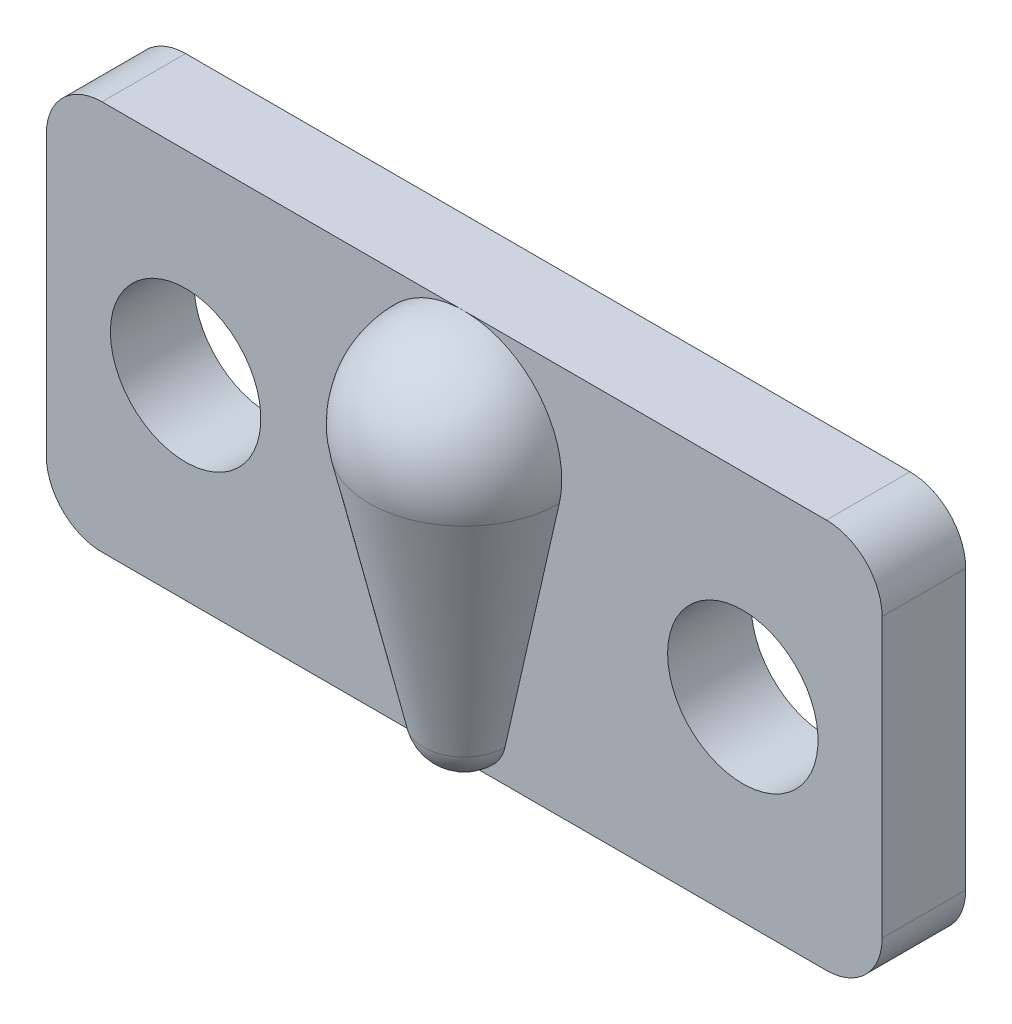
ISO-10303-21;
HEADER;
FILE_DESCRIPTION(('STEP AP214'),'2;1');
FILE_NAME('part.step','',(''),(''),'','','');
FILE_SCHEMA(('AUTOMOTIVE_DESIGN { 1 0 10303 214 1 1 1 1 }'));
ENDSEC;
DATA;
#1=APPLICATION_CONTEXT('core data for automotive mechanical design processes');
#2=APPLICATION_PROTOCOL_DEFINITION('international standard','automotive_design',2000,#1);
#3=PRODUCT_CONTEXT('',#1,'mechanical');
#4=PRODUCT('Part','Part','',(#3));
#5=PRODUCT_RELATED_PRODUCT_CATEGORY('part','',(#4));
#6=PRODUCT_DEFINITION_FORMATION('','',#4);
#7=PRODUCT_DEFINITION_CONTEXT('part definition',#1,'design');
#8=PRODUCT_DEFINITION('design','',#6,#7);
#9=PRODUCT_DEFINITION_SHAPE('','',#8);
#10=(LENGTH_UNIT() NAMED_UNIT(*) SI_UNIT(.MILLI.,.METRE.));
#11=(NAMED_UNIT(*) PLANE_ANGLE_UNIT() SI_UNIT($,.RADIAN.));
#12=(NAMED_UNIT(*) SI_UNIT($,.STERADIAN.) SOLID_ANGLE_UNIT());
#13=UNCERTAINTY_MEASURE_WITH_UNIT(LENGTH_MEASURE(1.E-05),#10,'distance_accuracy_value','');
#14=(GEOMETRIC_REPRESENTATION_CONTEXT(3) GLOBAL_UNCERTAINTY_ASSIGNED_CONTEXT((#13)) GLOBAL_UNIT_ASSIGNED_CONTEXT((#10,
#11,#12)) REPRESENTATION_CONTEXT('',''));
#15=CARTESIAN_POINT('',(0.,0.,0.));
#16=DIRECTION('',(0.,0.,1.));
#17=DIRECTION('',(1.,0.,0.));
#18=AXIS2_PLACEMENT_3D('',#15,#16,#17);
#19=CARTESIAN_POINT('',(15.,10.5000001043081,0.));
#20=DIRECTION('',(1.,0.,0.));
#21=DIRECTION('',(0.,1.,0.));
#22=AXIS2_PLACEMENT_3D('',#19,#20,#21);
#23=SPHERICAL_SURFACE('',#22,3.50000000000001);
#24=CARTESIAN_POINT('',(11.5875138472931,9.72222233554403,0.));
#25=CARTESIAN_POINT('',(11.5583884394164,9.85021598104194,0.));
#26=CARTESIAN_POINT('',(11.5365329148703,9.97902761785456,0.));
#27=CARTESIAN_POINT('',(11.5073616324393,10.2382868741093,0.));
#28=CARTESIAN_POINT('',(11.5000458745544,10.3687344935513,0.));
#29=CARTESIAN_POINT('',(11.5,10.5000001043081,0.));
#30=B_SPLINE_CURVE_WITH_KNOTS('',3,(#24,#25,#26,#27,#28,#29),.UNSPECIFIED.,.F.,.F.,(4,2,4),(0.,
0.391957798217862,0.783915596435724),.UNSPECIFIED.);
#31=CARTESIAN_POINT('',(11.5875138472902,9.72222233554242,0.));
#32=VERTEX_POINT('',#31);
#33=CARTESIAN_POINT('',(11.5,10.5000001041967,0.));
#34=VERTEX_POINT('',#33);
#35=EDGE_CURVE('E67',#32,#34,#30,.T.);
#36=ORIENTED_EDGE('',*,*,#35,.F.);
#37=CARTESIAN_POINT('',(15.,9.72222233554021,0.));
#38=DIRECTION('',(0.,1.,0.));
#39=DIRECTION('',(-1.,0.,0.));
#40=AXIS2_PLACEMENT_3D('',#37,#38,#39);
#41=CIRCLE('',#40,3.41248615271241);
#42=CARTESIAN_POINT('',(18.4124861527065,9.72222233554211,0.));
#43=VERTEX_POINT('',#42);
#44=EDGE_CURVE('E21',#43,#32,#41,.F.);
#45=ORIENTED_EDGE('',*,*,#44,.F.);
#46=CARTESIAN_POINT('',(18.5,10.5000001043081,0.));
#47=CARTESIAN_POINT('',(18.5,10.4999667709748,0.));
#48=CARTESIAN_POINT('',(18.4999999995238,10.4999334376414,0.));
#49=CARTESIAN_POINT('',(18.4999999966667,10.4998334376415,0.));
#50=CARTESIAN_POINT('',(18.4999999928572,10.4997667709749,0.));
#51=CARTESIAN_POINT('',(18.4999999642856,10.4994334376407,0.));
#52=CARTESIAN_POINT('',(18.4999999109516,10.4991667709745,0.));
#53=CARTESIAN_POINT('',(18.499999491908,10.4978334375931,0.));
#54=CARTESIAN_POINT('',(18.4999986690785,10.4967667710401,0.));
#55=CARTESIAN_POINT('',(18.4999921165338,10.4914334338371,0.));
#56=CARTESIAN_POINT('',(18.4999790716267,10.4871667699362,0.));
#57=CARTESIAN_POINT('',(18.499874846824,10.4658332089908,0.));
#58=CARTESIAN_POINT('',(18.4996666661411,10.4487668717378,0.));
#59=CARTESIAN_POINT('',(18.4980006604353,10.363418003463,0.));
#60=CARTESIAN_POINT('',(18.4946675281748,10.2951662442738,0.));
#61=CARTESIAN_POINT('',(18.476066568315,10.0573102485838,0.));
#62=CARTESIAN_POINT('',(18.450411237414,9.88845712822485,0.));
#63=CARTESIAN_POINT('',(18.4124861527069,9.72222233554402,0.));
#64=B_SPLINE_CURVE_WITH_KNOTS('',3,(#46,#47,#48,#49,#50,#51,#52,#53,#54,#55,#56,#57,#58,#59,#60,
#61,#62,#63),.UNSPECIFIED.,.F.,.F.,(4,2,2,2,2,2,2,2,4),(0.,9.99999999957324E-05,
0.000300000000078214,0.00110000000530257,0.00430000033967038,0.0171000217393052,
0.0683013914361899,0.273189175395802,0.783842066614435),.UNSPECIFIED.);
#65=CARTESIAN_POINT('',(18.5,10.5000001042563,0.));
#66=VERTEX_POINT('',#65);
#67=EDGE_CURVE('E53',#66,#43,#64,.T.);
#68=ORIENTED_EDGE('',*,*,#67,.F.);
#69=CARTESIAN_POINT('',(15.,14.0000001043081,0.));
#70=CARTESIAN_POINT('',(15.0984431740857,14.0000095369525,0.));
#71=CARTESIAN_POINT('',(15.1968818772213,13.995846827415,0.));
#72=CARTESIAN_POINT('',(15.3930549707358,13.9792501201021,0.));
#73=CARTESIAN_POINT('',(15.490789394673,13.9668165190966,0.));
#74=CARTESIAN_POINT('',(15.6847948111063,13.9337635043705,0.));
#75=CARTESIAN_POINT('',(15.7810668535947,13.9131502830936,0.));
#76=CARTESIAN_POINT('',(15.9715087844218,13.8639052324162,0.));
#77=CARTESIAN_POINT('',(16.0656786984063,13.8352735008992,0.));
#78=CARTESIAN_POINT('',(16.344126633369,13.7375818355791,0.));
#79=CARTESIAN_POINT('',(16.5244217973923,13.6567119083841,0.));
#80=CARTESIAN_POINT('',(16.8687435787846,13.4659044658187,0.));
#81=CARTESIAN_POINT('',(17.0327730550726,13.3559720710745,0.));
#82=CARTESIAN_POINT('',(17.3400751327783,13.1101235196639,0.));
#83=CARTESIAN_POINT('',(17.4833479367425,12.9742076165781,0.));
#84=CARTESIAN_POINT('',(17.7450631747737,12.6802224445225,0.));
#85=CARTESIAN_POINT('',(17.8635007458671,12.5221488469579,0.));
#86=CARTESIAN_POINT('',(18.0721742690406,12.1883448765278,0.));
#87=CARTESIAN_POINT('',(18.1624046999159,12.0126110557729,0.));
#88=CARTESIAN_POINT('',(18.3120343767606,11.6485240042632,0.));
#89=CARTESIAN_POINT('',(18.3714516804939,11.4601782378764,0.));
#90=CARTESIAN_POINT('',(18.4430029562399,11.1422332508819,0.));
#91=CARTESIAN_POINT('',(18.4643639355437,11.0146341445841,0.));
#92=CARTESIAN_POINT('',(18.4928605882357,10.7580412219548,0.));
#93=CARTESIAN_POINT('',(18.5000164285171,10.6290496446467,0.));
#94=CARTESIAN_POINT('',(18.5,10.5000001043081,0.));
#95=B_SPLINE_CURVE_WITH_KNOTS('',3,(#69,#70,#71,#72,#73,#74,#75,#76,#77,#78,#79,#80,#81,#82,#83,
#84,#85,#86,#87,#88,#89,#90,#91,#92,#93,#94),.UNSPECIFIED.,.F.,.F.,(4,2,2,2,2,2,2,2,2,2,2,2,4),
(0.,0.295233478936978,0.590452796001687,0.885449040138426,1.18044168335681,1.77018969764237,
2.35983387116613,2.94947229047199,3.53922605896779,4.1290951924164,4.71861824644686,
5.10600613161856,5.49284365165828),.UNSPECIFIED.);
#96=CARTESIAN_POINT('',(14.9999999999999,14.0000001043081,0.));
#97=VERTEX_POINT('',#96);
#98=EDGE_CURVE('E36',#97,#66,#95,.T.);
#99=ORIENTED_EDGE('',*,*,#98,.F.);
#100=CARTESIAN_POINT('',(11.5,10.5000001043081,0.));
#101=CARTESIAN_POINT('',(11.5,10.5000334376414,0.));
#102=CARTESIAN_POINT('',(11.5000000004762,10.5000667709747,0.));
#103=CARTESIAN_POINT('',(11.5000000033333,10.5001667709748,0.));
#104=CARTESIAN_POINT('',(11.5000000071429,10.5002334376415,0.));
#105=CARTESIAN_POINT('',(11.5000000357141,10.5005667709747,0.));
#106=CARTESIAN_POINT('',(11.5000000890459,10.5008334376352,0.));
#107=CARTESIAN_POINT('',(11.5000005081023,10.5021667710491,0.));
#108=CARTESIAN_POINT('',(11.5000013310192,10.5032334378236,0.));
#109=CARTESIAN_POINT('',(11.5000078830755,10.5085667737897,0.));
#110=CARTESIAN_POINT('',(11.5000209246299,10.5128334291996,0.));
#111=CARTESIAN_POINT('',(11.50012516815,10.5341670375495,0.));
#112=CARTESIAN_POINT('',(11.5003334773499,10.5512337002882,0.));
#113=CARTESIAN_POINT('',(11.50199876537,10.6365807509358,0.));
#114=CARTESIAN_POINT('',(11.5053269678084,10.7048200247367,0.));
#115=CARTESIAN_POINT('',(11.532125923477,11.0472225301645,0.));
#116=CARTESIAN_POINT('',(11.586072763711,11.3195954873131,0.));
#117=CARTESIAN_POINT('',(11.7931162755848,11.9559728241736,0.));
#118=CARTESIAN_POINT('',(11.9785847197418,12.3097828510257,0.));
#119=CARTESIAN_POINT('',(12.45595457839,12.9358795174852,0.));
#120=CARTESIAN_POINT('',(12.7478559928812,13.2081661570926,0.));
#121=CARTESIAN_POINT('',(13.4057529554578,13.6403617190398,0.));
#122=CARTESIAN_POINT('',(13.7717485035431,13.8002706413797,0.));
#123=CARTESIAN_POINT('',(14.4300737736027,13.9655136393528,0.));
#124=CARTESIAN_POINT('',(14.7151105789108,14.0011958328103,0.));
#125=CARTESIAN_POINT('',(14.9999999999998,14.0000001043081,0.));
#126=B_SPLINE_CURVE_WITH_KNOTS('',3,(#100,#101,#102,#103,#104,#105,#106,#107,#108,#109,#110,
#111,#112,#113,#114,#115,#116,#117,#118,#119,#120,#121,#122,#123,#124,#125),.UNSPECIFIED.,.F.,
.F.,(4,2,2,2,2,2,2,2,2,2,2,2,4),(0.,9.99999999974672E-05,0.000300000000081683,
0.00110000000532165,0.00430000033974497,0.0171000217396071,0.068301391437394,0.273189175400626,
1.09813788832138,2.27333769024742,3.44853749217326,4.6237372940991,5.47693354261219),.UNSPECIFIED.);
#127=EDGE_CURVE('E75',#34,#97,#126,.T.);
#128=ORIENTED_EDGE('',*,*,#127,.F.);
#129=EDGE_LOOP('',(#36,#45,#68,#99,#128));
#130=FACE_BOUND('',#129,.T.);
#131=ADVANCED_FACE('F16',(#130),#23,.T.);
#132=CARTESIAN_POINT('',(15.,1.5,0.));
#133=DIRECTION('',(1.,0.,0.));
#134=DIRECTION('',(0.,1.,0.));
#135=AXIS2_PLACEMENT_3D('',#132,#133,#134);
#136=SPHERICAL_SURFACE('',#135,1.5);
#137=CARTESIAN_POINT('',(15.,1.16666667054232,0.));
#138=DIRECTION('',(0.,1.,0.));
#139=DIRECTION('',(-1.,0.,0.));
#140=AXIS2_PLACEMENT_3D('',#137,#138,#139);
#141=CIRCLE('',#140,1.46249406546474);
#142=CARTESIAN_POINT('',(13.5375059345523,1.16666667053772,0.));
#143=VERTEX_POINT('',#142);
#144=CARTESIAN_POINT('',(16.4624940654553,1.16666667053613,0.));
#145=VERTEX_POINT('',#144);
#146=EDGE_CURVE('E62',#143,#145,#141,.T.);
#147=ORIENTED_EDGE('',*,*,#146,.F.);
#148=CARTESIAN_POINT('',(15.,0.,0.));
#149=CARTESIAN_POINT('',(14.9578050986256,2.77935319718293E-07,0.));
#150=CARTESIAN_POINT('',(14.9156304158705,0.00178152439827612,0.));
#151=CARTESIAN_POINT('',(14.8315827057819,0.0088876484830978,0.));
#152=CARTESIAN_POINT('',(14.7897096643425,0.0142123592967451,0.));
#153=CARTESIAN_POINT('',(14.665037693565,0.0354559329874701,0.));
#154=CARTESIAN_POINT('',(14.583074119106,0.0566443453035602,0.));
#155=CARTESIAN_POINT('',(14.4238759669673,0.112480899819473,0.));
#156=CARTESIAN_POINT('',(14.3466433728273,0.147134643464174,0.));
#157=CARTESIAN_POINT('',(14.1991113124499,0.228904501525037,0.));
#158=CARTESIAN_POINT('',(14.1288091589462,0.276015759261636,0.));
#159=CARTESIAN_POINT('',(13.9971120721194,0.381372713440135,0.));
#160=CARTESIAN_POINT('',(13.9357171836421,0.439618465937728,0.));
#161=CARTESIAN_POINT('',(13.8235558739275,0.565602655816355,0.));
#162=CARTESIAN_POINT('',(13.772793493613,0.633344686023538,0.));
#163=CARTESIAN_POINT('',(13.6837377237513,0.775816783554825,0.));
#164=CARTESIAN_POINT('',(13.6453412172359,0.850481997961585,0.));
#165=CARTESIAN_POINT('',(13.5974829133175,0.966424193465034,0.));
#166=CARTESIAN_POINT('',(13.5831471577024,1.00575402013557,0.));
#167=CARTESIAN_POINT('',(13.5578082775515,1.08547528457636,0.));
#168=CARTESIAN_POINT('',(13.5468053279957,1.1258667779656,0.));
#169=CARTESIAN_POINT('',(13.5375059345534,1.16666667053311,0.));
#170=B_SPLINE_CURVE_WITH_KNOTS('',3,(#148,#149,#150,#151,#152,#153,#154,#155,#156,#157,#158,
#159,#160,#161,#162,#163,#164,#165,#166,#167,#168,#169),.UNSPECIFIED.,.F.,.F.,(4,2,2,2,2,2,2,2,
2,2,4),(0.,0.126506957121976,0.253007959363255,0.505678836526512,0.758454935000744,
1.01113263124747,1.26381159961266,1.51658642597192,1.76719527814484,1.89265185363998,
2.01811501475424),.UNSPECIFIED.);
#171=CARTESIAN_POINT('',(15.,0.,0.));
#172=VERTEX_POINT('',#171);
#173=EDGE_CURVE('E122',#172,#143,#170,.T.);
#174=ORIENTED_EDGE('',*,*,#173,.F.);
#175=CARTESIAN_POINT('',(16.4624940654466,1.16666667053311,0.));
#176=CARTESIAN_POINT('',(16.4513165902117,1.11761098379538,0.));
#177=CARTESIAN_POINT('',(16.4376688163791,1.06914240379038,0.));
#178=CARTESIAN_POINT('',(16.4055552341362,0.973738479858017,0.));
#179=CARTESIAN_POINT('',(16.3870814307371,0.926805826968141,0.));
#180=CARTESIAN_POINT('',(16.331491717046,0.804139782691788,0.));
#181=CARTESIAN_POINT('',(16.2901924724462,0.730255675423558,0.));
#182=CARTESIAN_POINT('',(16.1957651827084,0.59045443018761,0.));
#183=CARTESIAN_POINT('',(16.1426297293297,0.524542321906371,0.));
#184=CARTESIAN_POINT('',(16.026064270163,0.402593394092276,0.));
#185=CARTESIAN_POINT('',(15.9626383318362,0.34655269092536,0.));
#186=CARTESIAN_POINT('',(15.8272652312903,0.24590806023571,0.));
#187=CARTESIAN_POINT('',(15.7553166953524,0.201305980129908,0.));
#188=CARTESIAN_POINT('',(15.6049248807638,0.124793711000501,0.));
#189=CARTESIAN_POINT('',(15.526478063613,0.092890492488666,0.));
#190=CARTESIAN_POINT('',(15.3653881597557,0.0427466325925461,0.));
#191=CARTESIAN_POINT('',(15.2827504717141,0.0244888677446481,0.));
#192=CARTESIAN_POINT('',(15.166212591902,0.00886247990249393,0.));
#193=CARTESIAN_POINT('',(15.1330260239435,0.00553762041778766,0.));
#194=CARTESIAN_POINT('',(15.0665645216017,0.00110913834698953,0.));
#195=CARTESIAN_POINT('',(15.0332898510599,1.5575224030013E-06,0.));
#196=CARTESIAN_POINT('',(15.,0.,0.));
#197=B_SPLINE_CURVE_WITH_KNOTS('',3,(#175,#176,#177,#178,#179,#180,#181,#182,#183,#184,#185,
#186,#187,#188,#189,#190,#191,#192,#193,#194,#195,#196),.UNSPECIFIED.,.F.,.F.,(4,2,2,2,2,2,2,2,
2,2,4),(0.,0.150828931150152,0.301909333653738,0.554556942069082,0.807363128265371,
1.06006963156119,1.31281692304303,1.56570275894767,1.81827071711802,1.91827022490933,
2.01809105595497),.UNSPECIFIED.);
#198=EDGE_CURVE('E73',#145,#172,#197,.T.);
#199=ORIENTED_EDGE('',*,*,#198,.F.);
#200=EDGE_LOOP('',(#147,#174,#199));
#201=FACE_BOUND('',#200,.T.);
#202=ADVANCED_FACE('F110',(#201),#136,.T.);
#203=CARTESIAN_POINT('',(15.,9.72222233554021,0.));
#204=DIRECTION('',(0.,1.,0.));
#205=DIRECTION('',(-1.,0.,0.));
#206=AXIS2_PLACEMENT_3D('',#203,#204,#205);
#207=CONICAL_SURFACE('',#206,3.41248615271241,0.224093089658739);
#208=DIRECTION('',(-0.222222219646717,0.974996043630581,0.));
#209=VECTOR('',#208,1.);
#210=CARTESIAN_POINT('',(13.5375059345541,1.16666667052993,0.));
#211=LINE('',#210,#209);
#212=EDGE_CURVE('E80',#143,#32,#211,.T.);
#213=ORIENTED_EDGE('',*,*,#212,.F.);
#214=ORIENTED_EDGE('',*,*,#146,.T.);
#215=DIRECTION('',(-0.222222219646706,-0.974996043630584,0.));
#216=VECTOR('',#215,1.);
#217=CARTESIAN_POINT('',(18.412486152707,9.72222233554464,0.));
#218=LINE('',#217,#216);
#219=EDGE_CURVE('E59',#43,#145,#218,.T.);
#220=ORIENTED_EDGE('',*,*,#219,.F.);
#221=ORIENTED_EDGE('',*,*,#44,.T.);
#222=EDGE_LOOP('',(#213,#214,#220,#221));
#223=FACE_BOUND('',#222,.T.);
#224=ADVANCED_FACE('F71',(#223),#207,.T.);
#225=CARTESIAN_POINT('',(15.,7.00000005215407,0.));
#226=DIRECTION('',(0.,0.,1.));
#227=DIRECTION('',(1.,0.,0.));
#228=AXIS2_PLACEMENT_3D('',#225,#226,#227);
#229=PLANE('',#228);
#230=CARTESIAN_POINT('',(25.,7.00000010430813,0.));
#231=DIRECTION('',(0.,0.,-1.));
#232=DIRECTION('',(-1.,0.,0.));
#233=AXIS2_PLACEMENT_3D('',#230,#231,#232);
#234=CIRCLE('',#233,2.7);
#235=CARTESIAN_POINT('',(22.3,7.00000010430813,0.));
#236=VERTEX_POINT('',#235);
#237=EDGE_CURVE('E214',#236,#236,#234,.T.);
#238=ORIENTED_EDGE('',*,*,#237,.T.);
#239=EDGE_LOOP('',(#238));
#240=FACE_BOUND('',#239,.T.);
#241=CARTESIAN_POINT('',(28.,12.0000001043081,0.));
#242=DIRECTION('',(0.,0.,-1.));
#243=DIRECTION('',(-1.,0.,0.));
#244=AXIS2_PLACEMENT_3D('',#241,#242,#243);
#245=CIRCLE('',#244,2.00000000000001);
#246=CARTESIAN_POINT('',(28.,14.0000001043081,0.));
#247=VERTEX_POINT('',#246);
#248=CARTESIAN_POINT('',(30.,12.0000001043081,0.));
#249=VERTEX_POINT('',#248);
#250=EDGE_CURVE('E161',#247,#249,#245,.T.);
#251=ORIENTED_EDGE('',*,*,#250,.F.);
#252=DIRECTION('',(1.,0.,0.));
#253=VECTOR('',#252,1.);
#254=CARTESIAN_POINT('',(2.,14.0000001043081,0.));
#255=LINE('',#254,#253);
#256=EDGE_CURVE('E96',#97,#247,#255,.T.);
#257=ORIENTED_EDGE('',*,*,#256,.F.);
#258=ORIENTED_EDGE('',*,*,#98,.T.);
#259=ORIENTED_EDGE('',*,*,#67,.T.);
#260=ORIENTED_EDGE('',*,*,#219,.T.);
#261=ORIENTED_EDGE('',*,*,#198,.T.);
#262=DIRECTION('',(1.,0.,0.));
#263=VECTOR('',#262,1.);
#264=CARTESIAN_POINT('',(28.,0.,0.));
#265=LINE('',#264,#263);
#266=CARTESIAN_POINT('',(28.,0.,0.));
#267=VERTEX_POINT('',#266);
#268=EDGE_CURVE('E85',#267,#172,#265,.F.);
#269=ORIENTED_EDGE('',*,*,#268,.F.);
#270=CARTESIAN_POINT('',(28.,2.,0.));
#271=DIRECTION('',(0.,0.,-1.));
#272=DIRECTION('',(-1.,0.,0.));
#273=AXIS2_PLACEMENT_3D('',#270,#271,#272);
#274=CIRCLE('',#273,2.);
#275=CARTESIAN_POINT('',(30.,2.,0.));
#276=VERTEX_POINT('',#275);
#277=EDGE_CURVE('E107',#276,#267,#274,.T.);
#278=ORIENTED_EDGE('',*,*,#277,.F.);
#279=DIRECTION('',(0.,1.,0.));
#280=VECTOR('',#279,1.);
#281=CARTESIAN_POINT('',(30.,12.0000001043081,0.));
#282=LINE('',#281,#280);
#283=EDGE_CURVE('E100',#249,#276,#282,.F.);
#284=ORIENTED_EDGE('',*,*,#283,.F.);
#285=EDGE_LOOP('',(#251,#257,#258,#259,#260,#261,#269,#278,#284));
#286=FACE_BOUND('',#285,.T.);
#287=ADVANCED_FACE('F56',(#240,#286),#229,.T.);
#288=CARTESIAN_POINT('',(15.,7.00000005215407,0.));
#289=DIRECTION('',(0.,0.,1.));
#290=DIRECTION('',(1.,0.,0.));
#291=AXIS2_PLACEMENT_3D('',#288,#289,#290);
#292=PLANE('',#291);
#293=CARTESIAN_POINT('',(5.,7.00000010430813,0.));
#294=DIRECTION('',(0.,0.,-1.));
#295=DIRECTION('',(-1.,0.,0.));
#296=AXIS2_PLACEMENT_3D('',#293,#294,#295);
#297=CIRCLE('',#296,2.7);
#298=CARTESIAN_POINT('',(2.3,7.00000010430813,0.));
#299=VERTEX_POINT('',#298);
#300=EDGE_CURVE('E209',#299,#299,#297,.T.);
#301=ORIENTED_EDGE('',*,*,#300,.T.);
#302=EDGE_LOOP('',(#301));
#303=FACE_BOUND('',#302,.T.);
#304=ORIENTED_EDGE('',*,*,#173,.T.);
#305=ORIENTED_EDGE('',*,*,#212,.T.);
#306=ORIENTED_EDGE('',*,*,#35,.T.);
#307=ORIENTED_EDGE('',*,*,#127,.T.);
#308=DIRECTION('',(1.,0.,0.));
#309=VECTOR('',#308,1.);
#310=CARTESIAN_POINT('',(2.,14.0000001043081,0.));
#311=LINE('',#310,#309);
#312=CARTESIAN_POINT('',(2.,14.0000001043081,0.));
#313=VERTEX_POINT('',#312);
#314=EDGE_CURVE('E91',#313,#97,#311,.T.);
#315=ORIENTED_EDGE('',*,*,#314,.F.);
#316=CARTESIAN_POINT('',(2.,12.0000001043081,0.));
#317=DIRECTION('',(0.,0.,-1.));
#318=DIRECTION('',(-1.,0.,0.));
#319=AXIS2_PLACEMENT_3D('',#316,#317,#318);
#320=CIRCLE('',#319,2.);
#321=CARTESIAN_POINT('',(0.,12.0000001043081,0.));
#322=VERTEX_POINT('',#321);
#323=EDGE_CURVE('E94',#322,#313,#320,.T.);
#324=ORIENTED_EDGE('',*,*,#323,.F.);
#325=DIRECTION('',(0.,-1.,0.));
#326=VECTOR('',#325,1.);
#327=CARTESIAN_POINT('',(0.,2.,0.));
#328=LINE('',#327,#326);
#329=CARTESIAN_POINT('',(0.,2.,0.));
#330=VERTEX_POINT('',#329);
#331=EDGE_CURVE('E86',#330,#322,#328,.F.);
#332=ORIENTED_EDGE('',*,*,#331,.F.);
#333=CARTESIAN_POINT('',(2.,2.,0.));
#334=DIRECTION('',(0.,0.,-1.));
#335=DIRECTION('',(-1.,0.,0.));
#336=AXIS2_PLACEMENT_3D('',#333,#334,#335);
#337=CIRCLE('',#336,2.);
#338=CARTESIAN_POINT('',(2.,0.,0.));
#339=VERTEX_POINT('',#338);
#340=EDGE_CURVE('E222',#339,#330,#337,.T.);
#341=ORIENTED_EDGE('',*,*,#340,.F.);
#342=DIRECTION('',(1.,0.,0.));
#343=VECTOR('',#342,1.);
#344=CARTESIAN_POINT('',(28.,0.,0.));
#345=LINE('',#344,#343);
#346=EDGE_CURVE('E82',#172,#339,#345,.F.);
#347=ORIENTED_EDGE('',*,*,#346,.F.);
#348=EDGE_LOOP('',(#304,#305,#306,#307,#315,#324,#332,#341,#347));
#349=FACE_BOUND('',#348,.T.);
#350=ADVANCED_FACE('F133',(#303,#349),#292,.T.);
#351=CARTESIAN_POINT('',(28.,0.,0.));
#352=DIRECTION('',(0.,-1.,0.));
#353=DIRECTION('',(0.,0.,-1.));
#354=AXIS2_PLACEMENT_3D('',#351,#352,#353);
#355=PLANE('',#354);
#356=DIRECTION('',(0.,0.,-1.));
#357=VECTOR('',#356,1.);
#358=CARTESIAN_POINT('',(28.,0.,0.));
#359=LINE('',#358,#357);
#360=CARTESIAN_POINT('',(28.,0.,-3.));
#361=VERTEX_POINT('',#360);
#362=EDGE_CURVE('E104',#267,#361,#359,.T.);
#363=ORIENTED_EDGE('',*,*,#362,.F.);
#364=ORIENTED_EDGE('',*,*,#268,.T.);
#365=ORIENTED_EDGE('',*,*,#346,.T.);
#366=DIRECTION('',(0.,0.,-1.));
#367=VECTOR('',#366,1.);
#368=CARTESIAN_POINT('',(2.,0.,0.));
#369=LINE('',#368,#367);
#370=CARTESIAN_POINT('',(2.,0.,-3.));
#371=VERTEX_POINT('',#370);
#372=EDGE_CURVE('E202',#371,#339,#369,.F.);
#373=ORIENTED_EDGE('',*,*,#372,.F.);
#374=DIRECTION('',(1.,0.,0.));
#375=VECTOR('',#374,1.);
#376=CARTESIAN_POINT('',(15.,0.,-3.));
#377=LINE('',#376,#375);
#378=EDGE_CURVE('E199',#371,#361,#377,.T.);
#379=ORIENTED_EDGE('',*,*,#378,.T.);
#380=EDGE_LOOP('',(#363,#364,#365,#373,#379));
#381=FACE_BOUND('',#380,.T.);
#382=ADVANCED_FACE('F137',(#381),#355,.T.);
#383=CARTESIAN_POINT('',(28.,2.,0.));
#384=DIRECTION('',(0.,0.,-1.));
#385=DIRECTION('',(-1.,0.,0.));
#386=AXIS2_PLACEMENT_3D('',#383,#384,#385);
#387=CYLINDRICAL_SURFACE('',#386,2.);
#388=CARTESIAN_POINT('',(28.,2.,-3.));
#389=DIRECTION('',(0.,0.,-1.));
#390=DIRECTION('',(-1.,0.,0.));
#391=AXIS2_PLACEMENT_3D('',#388,#389,#390);
#392=CIRCLE('',#391,2.);
#393=CARTESIAN_POINT('',(30.,2.,-3.));
#394=VERTEX_POINT('',#393);
#395=EDGE_CURVE('E208',#361,#394,#392,.F.);
#396=ORIENTED_EDGE('',*,*,#395,.T.);
#397=DIRECTION('',(0.,0.,1.));
#398=VECTOR('',#397,1.);
#399=CARTESIAN_POINT('',(30.,2.,0.));
#400=LINE('',#399,#398);
#401=EDGE_CURVE('E103',#276,#394,#400,.F.);
#402=ORIENTED_EDGE('',*,*,#401,.F.);
#403=ORIENTED_EDGE('',*,*,#277,.T.);
#404=ORIENTED_EDGE('',*,*,#362,.T.);
#405=EDGE_LOOP('',(#396,#402,#403,#404));
#406=FACE_BOUND('',#405,.T.);
#407=ADVANCED_FACE('F190',(#406),#387,.T.);
#408=CARTESIAN_POINT('',(30.,12.0000001043081,0.));
#409=DIRECTION('',(1.,0.,0.));
#410=DIRECTION('',(0.,1.,0.));
#411=AXIS2_PLACEMENT_3D('',#408,#409,#410);
#412=PLANE('',#411);
#413=DIRECTION('',(0.,1.,0.));
#414=VECTOR('',#413,1.);
#415=CARTESIAN_POINT('',(30.,7.00000005215407,-3.));
#416=LINE('',#415,#414);
#417=CARTESIAN_POINT('',(30.,12.0000001043081,-3.));
#418=VERTEX_POINT('',#417);
#419=EDGE_CURVE('E211',#394,#418,#416,.T.);
#420=ORIENTED_EDGE('',*,*,#419,.T.);
#421=DIRECTION('',(0.,0.,-1.));
#422=VECTOR('',#421,1.);
#423=CARTESIAN_POINT('',(30.,12.0000001043081,0.));
#424=LINE('',#423,#422);
#425=EDGE_CURVE('E99',#249,#418,#424,.T.);
#426=ORIENTED_EDGE('',*,*,#425,.F.);
#427=ORIENTED_EDGE('',*,*,#283,.T.);
#428=ORIENTED_EDGE('',*,*,#401,.T.);
#429=EDGE_LOOP('',(#420,#426,#427,#428));
#430=FACE_BOUND('',#429,.T.);
#431=ADVANCED_FACE('F287',(#430),#412,.T.);
#432=CARTESIAN_POINT('',(28.,12.0000001043081,0.));
#433=DIRECTION('',(0.,0.,-1.));
#434=DIRECTION('',(-1.,0.,0.));
#435=AXIS2_PLACEMENT_3D('',#432,#433,#434);
#436=CYLINDRICAL_SURFACE('',#435,2.00000000000001);
#437=CARTESIAN_POINT('',(28.,12.0000001043081,-3.));
#438=DIRECTION('',(0.,0.,-1.));
#439=DIRECTION('',(-1.,0.,0.));
#440=AXIS2_PLACEMENT_3D('',#437,#438,#439);
#441=CIRCLE('',#440,2.00000000000001);
#442=CARTESIAN_POINT('',(28.,14.0000001043081,-3.));
#443=VERTEX_POINT('',#442);
#444=EDGE_CURVE('E172',#418,#443,#441,.F.);
#445=ORIENTED_EDGE('',*,*,#444,.T.);
#446=DIRECTION('',(0.,0.,1.));
#447=VECTOR('',#446,1.);
#448=CARTESIAN_POINT('',(28.,14.0000001043081,0.));
#449=LINE('',#448,#447);
#450=EDGE_CURVE('E95',#247,#443,#449,.F.);
#451=ORIENTED_EDGE('',*,*,#450,.F.);
#452=ORIENTED_EDGE('',*,*,#250,.T.);
#453=ORIENTED_EDGE('',*,*,#425,.T.);
#454=EDGE_LOOP('',(#445,#451,#452,#453));
#455=FACE_BOUND('',#454,.T.);
#456=ADVANCED_FACE('F169',(#455),#436,.T.);
#457=CARTESIAN_POINT('',(2.,14.0000001043081,0.));
#458=DIRECTION('',(0.,1.,0.));
#459=DIRECTION('',(0.,0.,1.));
#460=AXIS2_PLACEMENT_3D('',#457,#458,#459);
#461=PLANE('',#460);
#462=DIRECTION('',(0.,0.,-1.));
#463=VECTOR('',#462,1.);
#464=CARTESIAN_POINT('',(2.,14.0000001043081,0.));
#465=LINE('',#464,#463);
#466=CARTESIAN_POINT('',(2.,14.0000001043081,-3.));
#467=VERTEX_POINT('',#466);
#468=EDGE_CURVE('E90',#313,#467,#465,.T.);
#469=ORIENTED_EDGE('',*,*,#468,.F.);
#470=ORIENTED_EDGE('',*,*,#314,.T.);
#471=ORIENTED_EDGE('',*,*,#256,.T.);
#472=ORIENTED_EDGE('',*,*,#450,.T.);
#473=DIRECTION('',(1.,0.,0.));
#474=VECTOR('',#473,1.);
#475=CARTESIAN_POINT('',(15.,14.0000001043081,-3.));
#476=LINE('',#475,#474);
#477=EDGE_CURVE('E246',#443,#467,#476,.F.);
#478=ORIENTED_EDGE('',*,*,#477,.T.);
#479=EDGE_LOOP('',(#469,#470,#471,#472,#478));
#480=FACE_BOUND('',#479,.T.);
#481=ADVANCED_FACE('F153',(#480),#461,.T.);
#482=CARTESIAN_POINT('',(2.,12.0000001043081,0.));
#483=DIRECTION('',(0.,0.,-1.));
#484=DIRECTION('',(-1.,0.,0.));
#485=AXIS2_PLACEMENT_3D('',#482,#483,#484);
#486=CYLINDRICAL_SURFACE('',#485,2.);
#487=CARTESIAN_POINT('',(2.,12.0000001043081,-3.));
#488=DIRECTION('',(0.,0.,-1.));
#489=DIRECTION('',(-1.,0.,0.));
#490=AXIS2_PLACEMENT_3D('',#487,#488,#489);
#491=CIRCLE('',#490,2.);
#492=CARTESIAN_POINT('',(0.,12.0000001043081,-3.));
#493=VERTEX_POINT('',#492);
#494=EDGE_CURVE('E243',#467,#493,#491,.F.);
#495=ORIENTED_EDGE('',*,*,#494,.T.);
#496=DIRECTION('',(0.,0.,1.));
#497=VECTOR('',#496,1.);
#498=CARTESIAN_POINT('',(0.,12.0000001043081,0.));
#499=LINE('',#498,#497);
#500=EDGE_CURVE('E89',#322,#493,#499,.F.);
#501=ORIENTED_EDGE('',*,*,#500,.F.);
#502=ORIENTED_EDGE('',*,*,#323,.T.);
#503=ORIENTED_EDGE('',*,*,#468,.T.);
#504=EDGE_LOOP('',(#495,#501,#502,#503));
#505=FACE_BOUND('',#504,.T.);
#506=ADVANCED_FACE('F242',(#505),#486,.T.);
#507=CARTESIAN_POINT('',(0.,2.,0.));
#508=DIRECTION('',(-1.,0.,0.));
#509=DIRECTION('',(0.,-1.,0.));
#510=AXIS2_PLACEMENT_3D('',#507,#508,#509);
#511=PLANE('',#510);
#512=DIRECTION('',(0.,1.,0.));
#513=VECTOR('',#512,1.);
#514=CARTESIAN_POINT('',(0.,7.00000005215407,-3.));
#515=LINE('',#514,#513);
#516=CARTESIAN_POINT('',(0.,2.,-3.));
#517=VERTEX_POINT('',#516);
#518=EDGE_CURVE('E247',#493,#517,#515,.F.);
#519=ORIENTED_EDGE('',*,*,#518,.T.);
#520=DIRECTION('',(0.,0.,-1.));
#521=VECTOR('',#520,1.);
#522=CARTESIAN_POINT('',(0.,2.,0.));
#523=LINE('',#522,#521);
#524=EDGE_CURVE('E219',#330,#517,#523,.T.);
#525=ORIENTED_EDGE('',*,*,#524,.F.);
#526=ORIENTED_EDGE('',*,*,#331,.T.);
#527=ORIENTED_EDGE('',*,*,#500,.T.);
#528=EDGE_LOOP('',(#519,#525,#526,#527));
#529=FACE_BOUND('',#528,.T.);
#530=ADVANCED_FACE('F278',(#529),#511,.T.);
#531=CARTESIAN_POINT('',(2.,2.,0.));
#532=DIRECTION('',(0.,0.,-1.));
#533=DIRECTION('',(-1.,0.,0.));
#534=AXIS2_PLACEMENT_3D('',#531,#532,#533);
#535=CYLINDRICAL_SURFACE('',#534,2.);
#536=CARTESIAN_POINT('',(2.,2.,-3.));
#537=DIRECTION('',(0.,0.,-1.));
#538=DIRECTION('',(-1.,0.,0.));
#539=AXIS2_PLACEMENT_3D('',#536,#537,#538);
#540=CIRCLE('',#539,2.);
#541=EDGE_CURVE('E251',#517,#371,#540,.F.);
#542=ORIENTED_EDGE('',*,*,#541,.T.);
#543=ORIENTED_EDGE('',*,*,#372,.T.);
#544=ORIENTED_EDGE('',*,*,#340,.T.);
#545=ORIENTED_EDGE('',*,*,#524,.T.);
#546=EDGE_LOOP('',(#542,#543,#544,#545));
#547=FACE_BOUND('',#546,.T.);
#548=ADVANCED_FACE('F274',(#547),#535,.T.);
#549=CARTESIAN_POINT('',(25.,7.00000010430813,0.));
#550=DIRECTION('',(0.,0.,-1.));
#551=DIRECTION('',(-1.,0.,0.));
#552=AXIS2_PLACEMENT_3D('',#549,#550,#551);
#553=CYLINDRICAL_SURFACE('',#552,2.7);
#554=ORIENTED_EDGE('',*,*,#237,.F.);
#555=EDGE_LOOP('',(#554));
#556=FACE_BOUND('',#555,.T.);
#557=CARTESIAN_POINT('',(25.,7.00000010430813,-3.));
#558=DIRECTION('',(0.,0.,-1.));
#559=DIRECTION('',(-1.,0.,0.));
#560=AXIS2_PLACEMENT_3D('',#557,#558,#559);
#561=CIRCLE('',#560,2.7);
#562=CARTESIAN_POINT('',(22.3,7.00000010430813,-3.));
#563=VERTEX_POINT('',#562);
#564=EDGE_CURVE('E27',#563,#563,#561,.T.);
#565=ORIENTED_EDGE('',*,*,#564,.T.);
#566=EDGE_LOOP('',(#565));
#567=FACE_BOUND('',#566,.T.);
#568=ADVANCED_FACE('F258',(#556,#567),#553,.F.);
#569=CARTESIAN_POINT('',(5.,7.00000010430813,0.));
#570=DIRECTION('',(0.,0.,-1.));
#571=DIRECTION('',(-1.,0.,0.));
#572=AXIS2_PLACEMENT_3D('',#569,#570,#571);
#573=CYLINDRICAL_SURFACE('',#572,2.7);
#574=ORIENTED_EDGE('',*,*,#300,.F.);
#575=EDGE_LOOP('',(#574));
#576=FACE_BOUND('',#575,.T.);
#577=CARTESIAN_POINT('',(5.,7.00000010430813,-3.));
#578=DIRECTION('',(0.,0.,-1.));
#579=DIRECTION('',(-1.,0.,0.));
#580=AXIS2_PLACEMENT_3D('',#577,#578,#579);
#581=CIRCLE('',#580,2.7);
#582=CARTESIAN_POINT('',(2.3,7.00000010430813,-3.));
#583=VERTEX_POINT('',#582);
#584=EDGE_CURVE('E11',#583,#583,#581,.T.);
#585=ORIENTED_EDGE('',*,*,#584,.T.);
#586=EDGE_LOOP('',(#585));
#587=FACE_BOUND('',#586,.T.);
#588=ADVANCED_FACE('F261',(#576,#587),#573,.F.);
#589=CARTESIAN_POINT('',(15.,7.00000005215407,-3.));
#590=DIRECTION('',(0.,0.,1.));
#591=DIRECTION('',(1.,0.,0.));
#592=AXIS2_PLACEMENT_3D('',#589,#590,#591);
#593=PLANE('',#592);
#594=ORIENTED_EDGE('',*,*,#584,.F.);
#595=EDGE_LOOP('',(#594));
#596=FACE_BOUND('',#595,.T.);
#597=ORIENTED_EDGE('',*,*,#564,.F.);
#598=EDGE_LOOP('',(#597));
#599=FACE_BOUND('',#598,.T.);
#600=ORIENTED_EDGE('',*,*,#518,.F.);
#601=ORIENTED_EDGE('',*,*,#494,.F.);
#602=ORIENTED_EDGE('',*,*,#477,.F.);
#603=ORIENTED_EDGE('',*,*,#444,.F.);
#604=ORIENTED_EDGE('',*,*,#419,.F.);
#605=ORIENTED_EDGE('',*,*,#395,.F.);
#606=ORIENTED_EDGE('',*,*,#378,.F.);
#607=ORIENTED_EDGE('',*,*,#541,.F.);
#608=EDGE_LOOP('',(#600,#601,#602,#603,#604,#605,#606,#607));
#609=FACE_BOUND('',#608,.T.);
#610=ADVANCED_FACE('F245',(#596,#599,#609),#593,.F.);
#611=CLOSED_SHELL('',(#131,#202,#224,#287,#350,#382,#407,#431,#456,#481,#506,#530,#548,#568,
#588,#610));
#612=MANIFOLD_SOLID_BREP('B1',#611);
#613=ADVANCED_BREP_SHAPE_REPRESENTATION('',(#18,#612),#14);
#614=SHAPE_DEFINITION_REPRESENTATION(#9,#613);
ENDSEC;
END-ISO-10303-21;
